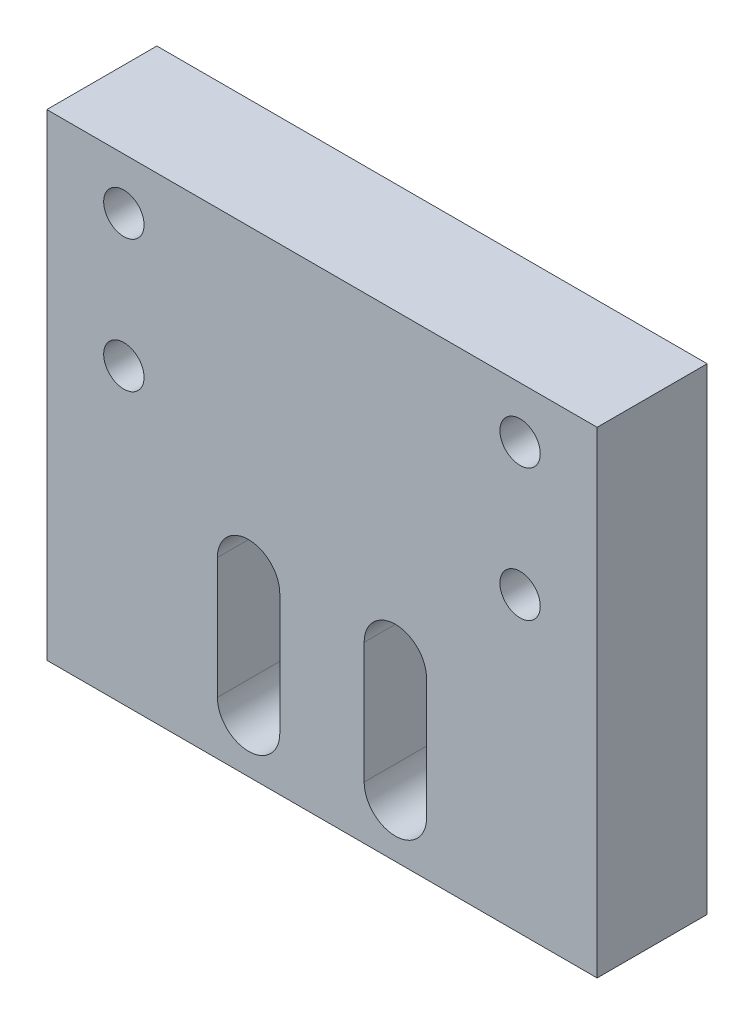
ISO-10303-21;
HEADER;
FILE_DESCRIPTION(('STEP AP214'),'2;1');
FILE_NAME('part.step','',(''),(''),'','','');
FILE_SCHEMA(('AUTOMOTIVE_DESIGN { 1 0 10303 214 1 1 1 1 }'));
ENDSEC;
DATA;
#1=APPLICATION_CONTEXT('core data for automotive mechanical design processes');
#2=APPLICATION_PROTOCOL_DEFINITION('international standard','automotive_design',2000,#1);
#3=PRODUCT_CONTEXT('',#1,'mechanical');
#4=PRODUCT('Part','Part','',(#3));
#5=PRODUCT_RELATED_PRODUCT_CATEGORY('part','',(#4));
#6=PRODUCT_DEFINITION_FORMATION('','',#4);
#7=PRODUCT_DEFINITION_CONTEXT('part definition',#1,'design');
#8=PRODUCT_DEFINITION('design','',#6,#7);
#9=PRODUCT_DEFINITION_SHAPE('','',#8);
#10=(LENGTH_UNIT() NAMED_UNIT(*) SI_UNIT(.MILLI.,.METRE.));
#11=(NAMED_UNIT(*) PLANE_ANGLE_UNIT() SI_UNIT($,.RADIAN.));
#12=(NAMED_UNIT(*) SI_UNIT($,.STERADIAN.) SOLID_ANGLE_UNIT());
#13=UNCERTAINTY_MEASURE_WITH_UNIT(LENGTH_MEASURE(1.E-05),#10,'distance_accuracy_value','');
#14=(GEOMETRIC_REPRESENTATION_CONTEXT(3) GLOBAL_UNCERTAINTY_ASSIGNED_CONTEXT((#13)) GLOBAL_UNIT_ASSIGNED_CONTEXT((#10,
#11,#12)) REPRESENTATION_CONTEXT('',''));
#15=CARTESIAN_POINT('',(0.,0.,0.));
#16=DIRECTION('',(0.,0.,1.));
#17=DIRECTION('',(1.,0.,0.));
#18=AXIS2_PLACEMENT_3D('',#15,#16,#17);
#19=CARTESIAN_POINT('',(0.,0.,15.));
#20=DIRECTION('',(0.,0.,1.));
#21=DIRECTION('',(1.,0.,0.));
#22=AXIS2_PLACEMENT_3D('',#19,#20,#21);
#23=PLANE('',#22);
#24=CARTESIAN_POINT('',(27.,26.9212439809893,15.));
#25=DIRECTION('',(0.,0.,1.));
#26=DIRECTION('',(1.,0.,0.));
#27=AXIS2_PLACEMENT_3D('',#24,#25,#26);
#28=CIRCLE('',#27,2.75);
#29=CARTESIAN_POINT('',(29.75,26.9212439809893,15.));
#30=VERTEX_POINT('',#29);
#31=EDGE_CURVE('E258',#30,#30,#28,.T.);
#32=ORIENTED_EDGE('',*,*,#31,.F.);
#33=EDGE_LOOP('',(#32));
#34=FACE_BOUND('',#33,.T.);
#35=CARTESIAN_POINT('',(-27.,26.9212439809893,15.));
#36=DIRECTION('',(0.,0.,1.));
#37=DIRECTION('',(1.,0.,0.));
#38=AXIS2_PLACEMENT_3D('',#35,#36,#37);
#39=CIRCLE('',#38,2.75);
#40=CARTESIAN_POINT('',(-24.25,26.9212439809893,15.));
#41=VERTEX_POINT('',#40);
#42=EDGE_CURVE('E259',#41,#41,#39,.T.);
#43=ORIENTED_EDGE('',*,*,#42,.F.);
#44=EDGE_LOOP('',(#43));
#45=FACE_BOUND('',#44,.T.);
#46=DIRECTION('',(0.,1.,0.));
#47=VECTOR('',#46,1.);
#48=CARTESIAN_POINT('',(37.5,33.9212439809893,15.));
#49=LINE('',#48,#47);
#50=CARTESIAN_POINT('',(37.5,-31.0787560190107,15.));
#51=VERTEX_POINT('',#50);
#52=CARTESIAN_POINT('',(37.5,33.9212439809893,15.));
#53=VERTEX_POINT('',#52);
#54=EDGE_CURVE('E271',#51,#53,#49,.T.);
#55=ORIENTED_EDGE('',*,*,#54,.T.);
#56=DIRECTION('',(-1.,0.,0.));
#57=VECTOR('',#56,1.);
#58=CARTESIAN_POINT('',(-37.5,33.9212439809893,15.));
#59=LINE('',#58,#57);
#60=CARTESIAN_POINT('',(-37.5,33.9212439809893,15.));
#61=VERTEX_POINT('',#60);
#62=EDGE_CURVE('E275',#53,#61,#59,.T.);
#63=ORIENTED_EDGE('',*,*,#62,.T.);
#64=DIRECTION('',(0.,-1.,0.));
#65=VECTOR('',#64,1.);
#66=CARTESIAN_POINT('',(-37.5,33.9212439809893,15.));
#67=LINE('',#66,#65);
#68=CARTESIAN_POINT('',(-37.5,-31.0787560190107,15.));
#69=VERTEX_POINT('',#68);
#70=EDGE_CURVE('E280',#61,#69,#67,.T.);
#71=ORIENTED_EDGE('',*,*,#70,.T.);
#72=DIRECTION('',(1.,0.,0.));
#73=VECTOR('',#72,1.);
#74=CARTESIAN_POINT('',(-37.5,-31.0787560190107,15.));
#75=LINE('',#74,#73);
#76=EDGE_CURVE('E283',#69,#51,#75,.T.);
#77=ORIENTED_EDGE('',*,*,#76,.T.);
#78=EDGE_LOOP('',(#55,#63,#71,#77));
#79=FACE_BOUND('',#78,.T.);
#80=CARTESIAN_POINT('',(-27.,8.92124398098932,15.));
#81=DIRECTION('',(0.,0.,1.));
#82=DIRECTION('',(1.,0.,0.));
#83=AXIS2_PLACEMENT_3D('',#80,#81,#82);
#84=CIRCLE('',#83,2.75);
#85=CARTESIAN_POINT('',(-24.25,8.92124398098932,15.));
#86=VERTEX_POINT('',#85);
#87=EDGE_CURVE('E247',#86,#86,#84,.T.);
#88=ORIENTED_EDGE('',*,*,#87,.F.);
#89=EDGE_LOOP('',(#88));
#90=FACE_BOUND('',#89,.T.);
#91=CARTESIAN_POINT('',(27.,8.92124398098932,15.));
#92=DIRECTION('',(0.,0.,1.));
#93=DIRECTION('',(1.,0.,0.));
#94=AXIS2_PLACEMENT_3D('',#91,#92,#93);
#95=CIRCLE('',#94,2.75);
#96=CARTESIAN_POINT('',(29.75,8.92124398098932,15.));
#97=VERTEX_POINT('',#96);
#98=EDGE_CURVE('E235',#97,#97,#95,.T.);
#99=ORIENTED_EDGE('',*,*,#98,.F.);
#100=EDGE_LOOP('',(#99));
#101=FACE_BOUND('',#100,.T.);
#102=DIRECTION('',(0.,-1.,0.));
#103=VECTOR('',#102,1.);
#104=CARTESIAN_POINT('',(-14.25,-7.32875601901067,15.));
#105=LINE('',#104,#103);
#106=CARTESIAN_POINT('',(-14.25,-7.32875601901067,15.));
#107=VERTEX_POINT('',#106);
#108=CARTESIAN_POINT('',(-14.25,-23.8287560190107,15.));
#109=VERTEX_POINT('',#108);
#110=EDGE_CURVE('E193',#107,#109,#105,.T.);
#111=ORIENTED_EDGE('',*,*,#110,.F.);
#112=CARTESIAN_POINT('',(-10.,-7.32875601901067,15.));
#113=DIRECTION('',(0.,0.,1.));
#114=DIRECTION('',(1.,0.,0.));
#115=AXIS2_PLACEMENT_3D('',#112,#113,#114);
#116=CIRCLE('',#115,4.25);
#117=CARTESIAN_POINT('',(-5.75,-7.32875601901067,15.));
#118=VERTEX_POINT('',#117);
#119=EDGE_CURVE('E189',#118,#107,#116,.T.);
#120=ORIENTED_EDGE('',*,*,#119,.F.);
#121=DIRECTION('',(0.,1.,0.));
#122=VECTOR('',#121,1.);
#123=CARTESIAN_POINT('',(-5.75,-7.32875601901067,15.));
#124=LINE('',#123,#122);
#125=CARTESIAN_POINT('',(-5.75,-23.8287560190107,15.));
#126=VERTEX_POINT('',#125);
#127=EDGE_CURVE('E200',#126,#118,#124,.T.);
#128=ORIENTED_EDGE('',*,*,#127,.F.);
#129=CARTESIAN_POINT('',(-9.99999999999999,-23.8287560190107,15.));
#130=DIRECTION('',(0.,0.,1.));
#131=DIRECTION('',(1.,0.,0.));
#132=AXIS2_PLACEMENT_3D('',#129,#130,#131);
#133=CIRCLE('',#132,4.25);
#134=EDGE_CURVE('E205',#109,#126,#133,.T.);
#135=ORIENTED_EDGE('',*,*,#134,.F.);
#136=EDGE_LOOP('',(#111,#120,#128,#135));
#137=FACE_BOUND('',#136,.T.);
#138=DIRECTION('',(0.,-1.,0.));
#139=VECTOR('',#138,1.);
#140=CARTESIAN_POINT('',(5.75000000000001,-7.32875601901066,15.));
#141=LINE('',#140,#139);
#142=CARTESIAN_POINT('',(5.75000000000001,-7.32875601901066,15.));
#143=VERTEX_POINT('',#142);
#144=CARTESIAN_POINT('',(5.75000000000001,-23.8287560190107,15.));
#145=VERTEX_POINT('',#144);
#146=EDGE_CURVE('E142',#143,#145,#141,.T.);
#147=ORIENTED_EDGE('',*,*,#146,.F.);
#148=CARTESIAN_POINT('',(10.,-7.32875601901066,15.));
#149=DIRECTION('',(0.,0.,1.));
#150=DIRECTION('',(1.,0.,0.));
#151=AXIS2_PLACEMENT_3D('',#148,#149,#150);
#152=CIRCLE('',#151,4.25);
#153=CARTESIAN_POINT('',(14.25,-7.32875601901066,15.));
#154=VERTEX_POINT('',#153);
#155=EDGE_CURVE('E133',#154,#143,#152,.T.);
#156=ORIENTED_EDGE('',*,*,#155,.F.);
#157=DIRECTION('',(0.,1.,0.));
#158=VECTOR('',#157,1.);
#159=CARTESIAN_POINT('',(14.25,-7.32875601901066,15.));
#160=LINE('',#159,#158);
#161=CARTESIAN_POINT('',(14.25,-23.8287560190107,15.));
#162=VERTEX_POINT('',#161);
#163=EDGE_CURVE('E159',#162,#154,#160,.T.);
#164=ORIENTED_EDGE('',*,*,#163,.F.);
#165=CARTESIAN_POINT('',(10.,-23.8287560190107,15.));
#166=DIRECTION('',(0.,0.,1.));
#167=DIRECTION('',(1.,0.,0.));
#168=AXIS2_PLACEMENT_3D('',#165,#166,#167);
#169=CIRCLE('',#168,4.25);
#170=EDGE_CURVE('E155',#145,#162,#169,.T.);
#171=ORIENTED_EDGE('',*,*,#170,.F.);
#172=EDGE_LOOP('',(#147,#156,#164,#171));
#173=FACE_BOUND('',#172,.T.);
#174=ADVANCED_FACE('F43',(#34,#45,#79,#90,#101,#137,#173),#23,.T.);
#175=CARTESIAN_POINT('',(0.,0.,0.));
#176=DIRECTION('',(0.,0.,1.));
#177=DIRECTION('',(1.,0.,0.));
#178=AXIS2_PLACEMENT_3D('',#175,#176,#177);
#179=PLANE('',#178);
#180=CARTESIAN_POINT('',(-10.,-7.32875601901067,0.));
#181=DIRECTION('',(0.,0.,1.));
#182=DIRECTION('',(1.,0.,0.));
#183=AXIS2_PLACEMENT_3D('',#180,#181,#182);
#184=CIRCLE('',#183,4.25);
#185=CARTESIAN_POINT('',(-5.75,-7.32875601901067,0.));
#186=VERTEX_POINT('',#185);
#187=CARTESIAN_POINT('',(-14.25,-7.32875601901067,0.));
#188=VERTEX_POINT('',#187);
#189=EDGE_CURVE('E151',#186,#188,#184,.T.);
#190=ORIENTED_EDGE('',*,*,#189,.T.);
#191=DIRECTION('',(0.,-1.,0.));
#192=VECTOR('',#191,1.);
#193=CARTESIAN_POINT('',(-14.25,-7.32875601901067,0.));
#194=LINE('',#193,#192);
#195=CARTESIAN_POINT('',(-14.25,-23.8287560190107,0.));
#196=VERTEX_POINT('',#195);
#197=EDGE_CURVE('E210',#188,#196,#194,.T.);
#198=ORIENTED_EDGE('',*,*,#197,.T.);
#199=CARTESIAN_POINT('',(-9.99999999999999,-23.8287560190107,0.));
#200=DIRECTION('',(0.,0.,1.));
#201=DIRECTION('',(1.,0.,0.));
#202=AXIS2_PLACEMENT_3D('',#199,#200,#201);
#203=CIRCLE('',#202,4.25);
#204=CARTESIAN_POINT('',(-5.75,-23.8287560190107,0.));
#205=VERTEX_POINT('',#204);
#206=EDGE_CURVE('E214',#196,#205,#203,.T.);
#207=ORIENTED_EDGE('',*,*,#206,.T.);
#208=DIRECTION('',(0.,1.,0.));
#209=VECTOR('',#208,1.);
#210=CARTESIAN_POINT('',(-5.75,-7.32875601901067,0.));
#211=LINE('',#210,#209);
#212=EDGE_CURVE('E194',#205,#186,#211,.T.);
#213=ORIENTED_EDGE('',*,*,#212,.T.);
#214=EDGE_LOOP('',(#190,#198,#207,#213));
#215=FACE_BOUND('',#214,.T.);
#216=DIRECTION('',(0.,1.,0.));
#217=VECTOR('',#216,1.);
#218=CARTESIAN_POINT('',(37.5,33.9212439809893,0.));
#219=LINE('',#218,#217);
#220=CARTESIAN_POINT('',(37.5,-31.0787560190107,0.));
#221=VERTEX_POINT('',#220);
#222=CARTESIAN_POINT('',(37.5,33.9212439809893,0.));
#223=VERTEX_POINT('',#222);
#224=EDGE_CURVE('E264',#221,#223,#219,.T.);
#225=ORIENTED_EDGE('',*,*,#224,.F.);
#226=DIRECTION('',(1.,0.,0.));
#227=VECTOR('',#226,1.);
#228=CARTESIAN_POINT('',(-37.5,-31.0787560190107,0.));
#229=LINE('',#228,#227);
#230=CARTESIAN_POINT('',(-37.5,-31.0787560190107,0.));
#231=VERTEX_POINT('',#230);
#232=EDGE_CURVE('E276',#231,#221,#229,.T.);
#233=ORIENTED_EDGE('',*,*,#232,.F.);
#234=DIRECTION('',(0.,-1.,0.));
#235=VECTOR('',#234,1.);
#236=CARTESIAN_POINT('',(-37.5,33.9212439809893,0.));
#237=LINE('',#236,#235);
#238=CARTESIAN_POINT('',(-37.5,33.9212439809893,0.));
#239=VERTEX_POINT('',#238);
#240=EDGE_CURVE('E294',#239,#231,#237,.T.);
#241=ORIENTED_EDGE('',*,*,#240,.F.);
#242=DIRECTION('',(-1.,0.,0.));
#243=VECTOR('',#242,1.);
#244=CARTESIAN_POINT('',(-37.5,33.9212439809893,0.));
#245=LINE('',#244,#243);
#246=EDGE_CURVE('E291',#223,#239,#245,.T.);
#247=ORIENTED_EDGE('',*,*,#246,.F.);
#248=EDGE_LOOP('',(#225,#233,#241,#247));
#249=FACE_BOUND('',#248,.T.);
#250=CARTESIAN_POINT('',(-27.,26.9212439809893,0.));
#251=DIRECTION('',(0.,0.,1.));
#252=DIRECTION('',(1.,0.,0.));
#253=AXIS2_PLACEMENT_3D('',#250,#251,#252);
#254=CIRCLE('',#253,2.75);
#255=CARTESIAN_POINT('',(-24.25,26.9212439809893,0.));
#256=VERTEX_POINT('',#255);
#257=EDGE_CURVE('E253',#256,#256,#254,.T.);
#258=ORIENTED_EDGE('',*,*,#257,.T.);
#259=EDGE_LOOP('',(#258));
#260=FACE_BOUND('',#259,.T.);
#261=CARTESIAN_POINT('',(-27.,8.92124398098932,0.));
#262=DIRECTION('',(0.,0.,1.));
#263=DIRECTION('',(1.,0.,0.));
#264=AXIS2_PLACEMENT_3D('',#261,#262,#263);
#265=CIRCLE('',#264,2.75);
#266=CARTESIAN_POINT('',(-24.25,8.92124398098932,0.));
#267=VERTEX_POINT('',#266);
#268=EDGE_CURVE('E254',#267,#267,#265,.T.);
#269=ORIENTED_EDGE('',*,*,#268,.T.);
#270=EDGE_LOOP('',(#269));
#271=FACE_BOUND('',#270,.T.);
#272=CARTESIAN_POINT('',(27.,26.9212439809893,0.));
#273=DIRECTION('',(0.,0.,1.));
#274=DIRECTION('',(1.,0.,0.));
#275=AXIS2_PLACEMENT_3D('',#272,#273,#274);
#276=CIRCLE('',#275,2.75);
#277=CARTESIAN_POINT('',(29.75,26.9212439809893,0.));
#278=VERTEX_POINT('',#277);
#279=EDGE_CURVE('E240',#278,#278,#276,.T.);
#280=ORIENTED_EDGE('',*,*,#279,.T.);
#281=EDGE_LOOP('',(#280));
#282=FACE_BOUND('',#281,.T.);
#283=CARTESIAN_POINT('',(27.,8.92124398098932,0.));
#284=DIRECTION('',(0.,0.,1.));
#285=DIRECTION('',(1.,0.,0.));
#286=AXIS2_PLACEMENT_3D('',#283,#284,#285);
#287=CIRCLE('',#286,2.75);
#288=CARTESIAN_POINT('',(29.75,8.92124398098932,0.));
#289=VERTEX_POINT('',#288);
#290=EDGE_CURVE('E234',#289,#289,#287,.T.);
#291=ORIENTED_EDGE('',*,*,#290,.T.);
#292=EDGE_LOOP('',(#291));
#293=FACE_BOUND('',#292,.T.);
#294=CARTESIAN_POINT('',(10.,-7.32875601901066,0.));
#295=DIRECTION('',(0.,0.,1.));
#296=DIRECTION('',(1.,0.,0.));
#297=AXIS2_PLACEMENT_3D('',#294,#295,#296);
#298=CIRCLE('',#297,4.25);
#299=CARTESIAN_POINT('',(14.25,-7.32875601901066,0.));
#300=VERTEX_POINT('',#299);
#301=CARTESIAN_POINT('',(5.75000000000001,-7.32875601901066,0.));
#302=VERTEX_POINT('',#301);
#303=EDGE_CURVE('E67',#300,#302,#298,.T.);
#304=ORIENTED_EDGE('',*,*,#303,.T.);
#305=DIRECTION('',(0.,-1.,0.));
#306=VECTOR('',#305,1.);
#307=CARTESIAN_POINT('',(5.75000000000001,-7.32875601901066,0.));
#308=LINE('',#307,#306);
#309=CARTESIAN_POINT('',(5.75000000000001,-23.8287560190107,0.));
#310=VERTEX_POINT('',#309);
#311=EDGE_CURVE('E149',#302,#310,#308,.T.);
#312=ORIENTED_EDGE('',*,*,#311,.T.);
#313=CARTESIAN_POINT('',(10.,-23.8287560190107,0.));
#314=DIRECTION('',(0.,0.,1.));
#315=DIRECTION('',(1.,0.,0.));
#316=AXIS2_PLACEMENT_3D('',#313,#314,#315);
#317=CIRCLE('',#316,4.25);
#318=CARTESIAN_POINT('',(14.25,-23.8287560190107,0.));
#319=VERTEX_POINT('',#318);
#320=EDGE_CURVE('E176',#310,#319,#317,.T.);
#321=ORIENTED_EDGE('',*,*,#320,.T.);
#322=DIRECTION('',(0.,1.,0.));
#323=VECTOR('',#322,1.);
#324=CARTESIAN_POINT('',(14.25,-7.32875601901066,0.));
#325=LINE('',#324,#323);
#326=EDGE_CURVE('E143',#319,#300,#325,.T.);
#327=ORIENTED_EDGE('',*,*,#326,.T.);
#328=EDGE_LOOP('',(#304,#312,#321,#327));
#329=FACE_BOUND('',#328,.T.);
#330=ADVANCED_FACE('F317',(#215,#249,#260,#271,#282,#293,#329),#179,.F.);
#331=CARTESIAN_POINT('',(37.5,33.9212439809893,15.));
#332=DIRECTION('',(-1.,0.,0.));
#333=DIRECTION('',(0.,-1.,0.));
#334=AXIS2_PLACEMENT_3D('',#331,#332,#333);
#335=PLANE('',#334);
#336=ORIENTED_EDGE('',*,*,#224,.T.);
#337=DIRECTION('',(0.,0.,-1.));
#338=VECTOR('',#337,1.);
#339=CARTESIAN_POINT('',(37.5,33.9212439809893,15.));
#340=LINE('',#339,#338);
#341=EDGE_CURVE('E12',#53,#223,#340,.T.);
#342=ORIENTED_EDGE('',*,*,#341,.F.);
#343=ORIENTED_EDGE('',*,*,#54,.F.);
#344=DIRECTION('',(0.,0.,-1.));
#345=VECTOR('',#344,1.);
#346=CARTESIAN_POINT('',(37.5,-31.0787560190107,15.));
#347=LINE('',#346,#345);
#348=EDGE_CURVE('E287',#51,#221,#347,.T.);
#349=ORIENTED_EDGE('',*,*,#348,.T.);
#350=EDGE_LOOP('',(#336,#342,#343,#349));
#351=FACE_BOUND('',#350,.T.);
#352=ADVANCED_FACE('F45',(#351),#335,.F.);
#353=CARTESIAN_POINT('',(-37.5,33.9212439809893,15.));
#354=DIRECTION('',(0.,-1.,0.));
#355=DIRECTION('',(0.,0.,-1.));
#356=AXIS2_PLACEMENT_3D('',#353,#354,#355);
#357=PLANE('',#356);
#358=ORIENTED_EDGE('',*,*,#246,.T.);
#359=DIRECTION('',(0.,0.,-1.));
#360=VECTOR('',#359,1.);
#361=CARTESIAN_POINT('',(-37.5,33.9212439809893,15.));
#362=LINE('',#361,#360);
#363=EDGE_CURVE('E52',#61,#239,#362,.T.);
#364=ORIENTED_EDGE('',*,*,#363,.F.);
#365=ORIENTED_EDGE('',*,*,#62,.F.);
#366=ORIENTED_EDGE('',*,*,#341,.T.);
#367=EDGE_LOOP('',(#358,#364,#365,#366));
#368=FACE_BOUND('',#367,.T.);
#369=ADVANCED_FACE('F328',(#368),#357,.F.);
#370=CARTESIAN_POINT('',(-37.5,33.9212439809893,15.));
#371=DIRECTION('',(1.,0.,0.));
#372=DIRECTION('',(0.,1.,0.));
#373=AXIS2_PLACEMENT_3D('',#370,#371,#372);
#374=PLANE('',#373);
#375=ORIENTED_EDGE('',*,*,#240,.T.);
#376=DIRECTION('',(0.,0.,-1.));
#377=VECTOR('',#376,1.);
#378=CARTESIAN_POINT('',(-37.5,-31.0787560190107,15.));
#379=LINE('',#378,#377);
#380=EDGE_CURVE('E302',#69,#231,#379,.T.);
#381=ORIENTED_EDGE('',*,*,#380,.F.);
#382=ORIENTED_EDGE('',*,*,#70,.F.);
#383=ORIENTED_EDGE('',*,*,#363,.T.);
#384=EDGE_LOOP('',(#375,#381,#382,#383));
#385=FACE_BOUND('',#384,.T.);
#386=ADVANCED_FACE('F311',(#385),#374,.F.);
#387=CARTESIAN_POINT('',(-37.5,-31.0787560190107,15.));
#388=DIRECTION('',(0.,1.,0.));
#389=DIRECTION('',(0.,0.,1.));
#390=AXIS2_PLACEMENT_3D('',#387,#388,#389);
#391=PLANE('',#390);
#392=ORIENTED_EDGE('',*,*,#232,.T.);
#393=ORIENTED_EDGE('',*,*,#348,.F.);
#394=ORIENTED_EDGE('',*,*,#76,.F.);
#395=ORIENTED_EDGE('',*,*,#380,.T.);
#396=EDGE_LOOP('',(#392,#393,#394,#395));
#397=FACE_BOUND('',#396,.T.);
#398=ADVANCED_FACE('F321',(#397),#391,.F.);
#399=CARTESIAN_POINT('',(-27.,26.9212439809893,15.));
#400=DIRECTION('',(0.,0.,-1.));
#401=DIRECTION('',(-1.,0.,0.));
#402=AXIS2_PLACEMENT_3D('',#399,#400,#401);
#403=CYLINDRICAL_SURFACE('',#402,2.75);
#404=ORIENTED_EDGE('',*,*,#42,.T.);
#405=EDGE_LOOP('',(#404));
#406=FACE_BOUND('',#405,.T.);
#407=ORIENTED_EDGE('',*,*,#257,.F.);
#408=EDGE_LOOP('',(#407));
#409=FACE_BOUND('',#408,.T.);
#410=ADVANCED_FACE('F346',(#406,#409),#403,.F.);
#411=CARTESIAN_POINT('',(-27.,8.92124398098932,15.));
#412=DIRECTION('',(0.,0.,-1.));
#413=DIRECTION('',(-1.,0.,0.));
#414=AXIS2_PLACEMENT_3D('',#411,#412,#413);
#415=CYLINDRICAL_SURFACE('',#414,2.75);
#416=ORIENTED_EDGE('',*,*,#87,.T.);
#417=EDGE_LOOP('',(#416));
#418=FACE_BOUND('',#417,.T.);
#419=ORIENTED_EDGE('',*,*,#268,.F.);
#420=EDGE_LOOP('',(#419));
#421=FACE_BOUND('',#420,.T.);
#422=ADVANCED_FACE('F353',(#418,#421),#415,.F.);
#423=CARTESIAN_POINT('',(27.,26.9212439809893,15.));
#424=DIRECTION('',(0.,0.,-1.));
#425=DIRECTION('',(-1.,0.,0.));
#426=AXIS2_PLACEMENT_3D('',#423,#424,#425);
#427=CYLINDRICAL_SURFACE('',#426,2.75);
#428=ORIENTED_EDGE('',*,*,#31,.T.);
#429=EDGE_LOOP('',(#428));
#430=FACE_BOUND('',#429,.T.);
#431=ORIENTED_EDGE('',*,*,#279,.F.);
#432=EDGE_LOOP('',(#431));
#433=FACE_BOUND('',#432,.T.);
#434=ADVANCED_FACE('F358',(#430,#433),#427,.F.);
#435=CARTESIAN_POINT('',(27.,8.92124398098932,15.));
#436=DIRECTION('',(0.,0.,-1.));
#437=DIRECTION('',(-1.,0.,0.));
#438=AXIS2_PLACEMENT_3D('',#435,#436,#437);
#439=CYLINDRICAL_SURFACE('',#438,2.75);
#440=ORIENTED_EDGE('',*,*,#98,.T.);
#441=EDGE_LOOP('',(#440));
#442=FACE_BOUND('',#441,.T.);
#443=ORIENTED_EDGE('',*,*,#290,.F.);
#444=EDGE_LOOP('',(#443));
#445=FACE_BOUND('',#444,.T.);
#446=ADVANCED_FACE('F393',(#442,#445),#439,.F.);
#447=CARTESIAN_POINT('',(-10.,-7.32875601901067,15.));
#448=DIRECTION('',(0.,0.,-1.));
#449=DIRECTION('',(-1.,0.,0.));
#450=AXIS2_PLACEMENT_3D('',#447,#448,#449);
#451=CYLINDRICAL_SURFACE('',#450,4.25);
#452=ORIENTED_EDGE('',*,*,#189,.F.);
#453=DIRECTION('',(0.,0.,-1.));
#454=VECTOR('',#453,1.);
#455=CARTESIAN_POINT('',(-5.75,-7.32875601901067,15.));
#456=LINE('',#455,#454);
#457=EDGE_CURVE('E204',#118,#186,#456,.T.);
#458=ORIENTED_EDGE('',*,*,#457,.F.);
#459=ORIENTED_EDGE('',*,*,#119,.T.);
#460=DIRECTION('',(0.,0.,-1.));
#461=VECTOR('',#460,1.);
#462=CARTESIAN_POINT('',(-14.25,-7.32875601901067,15.));
#463=LINE('',#462,#461);
#464=EDGE_CURVE('E230',#107,#188,#463,.T.);
#465=ORIENTED_EDGE('',*,*,#464,.T.);
#466=EDGE_LOOP('',(#452,#458,#459,#465));
#467=FACE_BOUND('',#466,.T.);
#468=ADVANCED_FACE('F391',(#467),#451,.F.);
#469=CARTESIAN_POINT('',(-14.25,-7.32875601901067,15.));
#470=DIRECTION('',(1.,0.,0.));
#471=DIRECTION('',(0.,1.,0.));
#472=AXIS2_PLACEMENT_3D('',#469,#470,#471);
#473=PLANE('',#472);
#474=ORIENTED_EDGE('',*,*,#197,.F.);
#475=ORIENTED_EDGE('',*,*,#464,.F.);
#476=ORIENTED_EDGE('',*,*,#110,.T.);
#477=DIRECTION('',(0.,0.,-1.));
#478=VECTOR('',#477,1.);
#479=CARTESIAN_POINT('',(-14.25,-23.8287560190107,15.));
#480=LINE('',#479,#478);
#481=EDGE_CURVE('E227',#109,#196,#480,.T.);
#482=ORIENTED_EDGE('',*,*,#481,.T.);
#483=EDGE_LOOP('',(#474,#475,#476,#482));
#484=FACE_BOUND('',#483,.T.);
#485=ADVANCED_FACE('F378',(#484),#473,.T.);
#486=CARTESIAN_POINT('',(-9.99999999999999,-23.8287560190107,15.));
#487=DIRECTION('',(0.,0.,-1.));
#488=DIRECTION('',(-1.,0.,0.));
#489=AXIS2_PLACEMENT_3D('',#486,#487,#488);
#490=CYLINDRICAL_SURFACE('',#489,4.25);
#491=ORIENTED_EDGE('',*,*,#206,.F.);
#492=ORIENTED_EDGE('',*,*,#481,.F.);
#493=ORIENTED_EDGE('',*,*,#134,.T.);
#494=DIRECTION('',(0.,0.,-1.));
#495=VECTOR('',#494,1.);
#496=CARTESIAN_POINT('',(-5.75,-23.8287560190107,15.));
#497=LINE('',#496,#495);
#498=EDGE_CURVE('E224',#126,#205,#497,.T.);
#499=ORIENTED_EDGE('',*,*,#498,.T.);
#500=EDGE_LOOP('',(#491,#492,#493,#499));
#501=FACE_BOUND('',#500,.T.);
#502=ADVANCED_FACE('F384',(#501),#490,.F.);
#503=CARTESIAN_POINT('',(-5.75,-7.32875601901067,15.));
#504=DIRECTION('',(-1.,0.,0.));
#505=DIRECTION('',(0.,-1.,0.));
#506=AXIS2_PLACEMENT_3D('',#503,#504,#505);
#507=PLANE('',#506);
#508=ORIENTED_EDGE('',*,*,#212,.F.);
#509=ORIENTED_EDGE('',*,*,#498,.F.);
#510=ORIENTED_EDGE('',*,*,#127,.T.);
#511=ORIENTED_EDGE('',*,*,#457,.T.);
#512=EDGE_LOOP('',(#508,#509,#510,#511));
#513=FACE_BOUND('',#512,.T.);
#514=ADVANCED_FACE('F389',(#513),#507,.T.);
#515=CARTESIAN_POINT('',(10.,-7.32875601901066,15.));
#516=DIRECTION('',(0.,0.,-1.));
#517=DIRECTION('',(-1.,0.,0.));
#518=AXIS2_PLACEMENT_3D('',#515,#516,#517);
#519=CYLINDRICAL_SURFACE('',#518,4.25);
#520=ORIENTED_EDGE('',*,*,#303,.F.);
#521=DIRECTION('',(0.,0.,-1.));
#522=VECTOR('',#521,1.);
#523=CARTESIAN_POINT('',(14.25,-7.32875601901066,15.));
#524=LINE('',#523,#522);
#525=EDGE_CURVE('E137',#154,#300,#524,.T.);
#526=ORIENTED_EDGE('',*,*,#525,.F.);
#527=ORIENTED_EDGE('',*,*,#155,.T.);
#528=DIRECTION('',(0.,0.,-1.));
#529=VECTOR('',#528,1.);
#530=CARTESIAN_POINT('',(5.75000000000001,-7.32875601901066,15.));
#531=LINE('',#530,#529);
#532=EDGE_CURVE('E136',#143,#302,#531,.T.);
#533=ORIENTED_EDGE('',*,*,#532,.T.);
#534=EDGE_LOOP('',(#520,#526,#527,#533));
#535=FACE_BOUND('',#534,.T.);
#536=ADVANCED_FACE('F135',(#535),#519,.F.);
#537=CARTESIAN_POINT('',(5.75000000000001,-7.32875601901066,15.));
#538=DIRECTION('',(1.,0.,0.));
#539=DIRECTION('',(0.,1.,0.));
#540=AXIS2_PLACEMENT_3D('',#537,#538,#539);
#541=PLANE('',#540);
#542=ORIENTED_EDGE('',*,*,#311,.F.);
#543=ORIENTED_EDGE('',*,*,#532,.F.);
#544=ORIENTED_EDGE('',*,*,#146,.T.);
#545=DIRECTION('',(0.,0.,-1.));
#546=VECTOR('',#545,1.);
#547=CARTESIAN_POINT('',(5.75000000000001,-23.8287560190107,15.));
#548=LINE('',#547,#546);
#549=EDGE_CURVE('E152',#145,#310,#548,.T.);
#550=ORIENTED_EDGE('',*,*,#549,.T.);
#551=EDGE_LOOP('',(#542,#543,#544,#550));
#552=FACE_BOUND('',#551,.T.);
#553=ADVANCED_FACE('F146',(#552),#541,.T.);
#554=CARTESIAN_POINT('',(10.,-23.8287560190107,15.));
#555=DIRECTION('',(0.,0.,-1.));
#556=DIRECTION('',(-1.,0.,0.));
#557=AXIS2_PLACEMENT_3D('',#554,#555,#556);
#558=CYLINDRICAL_SURFACE('',#557,4.25);
#559=ORIENTED_EDGE('',*,*,#320,.F.);
#560=ORIENTED_EDGE('',*,*,#549,.F.);
#561=ORIENTED_EDGE('',*,*,#170,.T.);
#562=DIRECTION('',(0.,0.,-1.));
#563=VECTOR('',#562,1.);
#564=CARTESIAN_POINT('',(14.25,-23.8287560190107,15.));
#565=LINE('',#564,#563);
#566=EDGE_CURVE('E59',#162,#319,#565,.T.);
#567=ORIENTED_EDGE('',*,*,#566,.T.);
#568=EDGE_LOOP('',(#559,#560,#561,#567));
#569=FACE_BOUND('',#568,.T.);
#570=ADVANCED_FACE('F417',(#569),#558,.F.);
#571=CARTESIAN_POINT('',(14.25,-7.32875601901066,15.));
#572=DIRECTION('',(-1.,0.,0.));
#573=DIRECTION('',(0.,-1.,0.));
#574=AXIS2_PLACEMENT_3D('',#571,#572,#573);
#575=PLANE('',#574);
#576=ORIENTED_EDGE('',*,*,#326,.F.);
#577=ORIENTED_EDGE('',*,*,#566,.F.);
#578=ORIENTED_EDGE('',*,*,#163,.T.);
#579=ORIENTED_EDGE('',*,*,#525,.T.);
#580=EDGE_LOOP('',(#576,#577,#578,#579));
#581=FACE_BOUND('',#580,.T.);
#582=ADVANCED_FACE('F415',(#581),#575,.T.);
#583=CLOSED_SHELL('',(#174,#330,#352,#369,#386,#398,#410,#422,#434,#446,#468,#485,#502,#514,
#536,#553,#570,#582));
#584=MANIFOLD_SOLID_BREP('B2',#583);
#585=ADVANCED_BREP_SHAPE_REPRESENTATION('',(#18,#584),#14);
#586=SHAPE_DEFINITION_REPRESENTATION(#9,#585);
ENDSEC;
END-ISO-10303-21;
